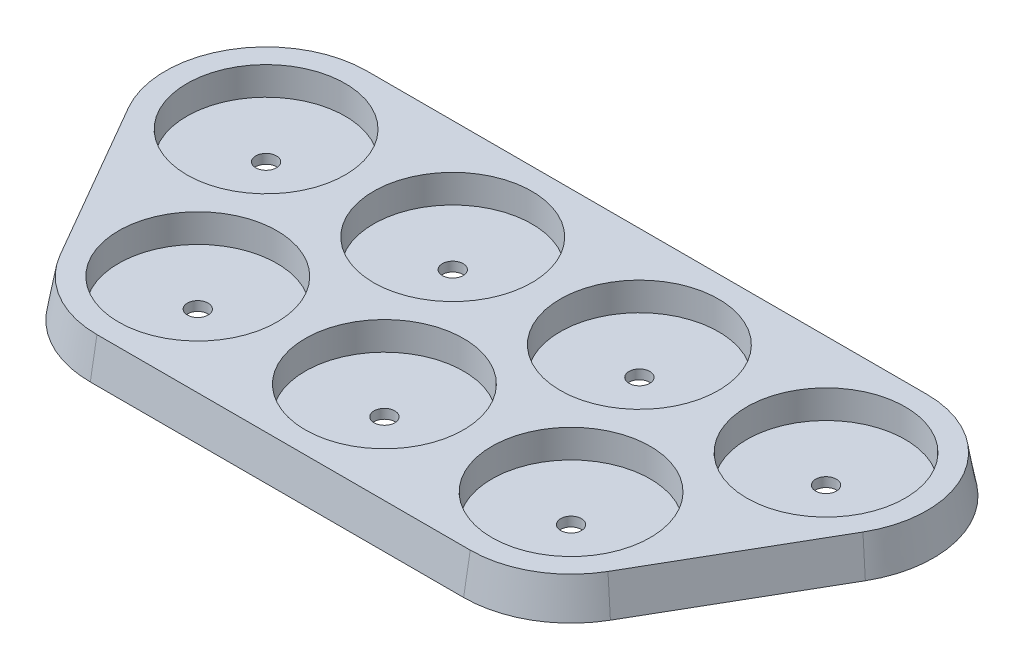
ISO-10303-21;
HEADER;
FILE_DESCRIPTION(('STEP AP214'),'2;1');
FILE_NAME('part.step','',(''),(''),'','','');
FILE_SCHEMA(('AUTOMOTIVE_DESIGN { 1 0 10303 214 1 1 1 1 }'));
ENDSEC;
DATA;
#1=APPLICATION_CONTEXT('core data for automotive mechanical design processes');
#2=APPLICATION_PROTOCOL_DEFINITION('international standard','automotive_design',2000,#1);
#3=PRODUCT_CONTEXT('',#1,'mechanical');
#4=PRODUCT('Part','Part','',(#3));
#5=PRODUCT_RELATED_PRODUCT_CATEGORY('part','',(#4));
#6=PRODUCT_DEFINITION_FORMATION('','',#4);
#7=PRODUCT_DEFINITION_CONTEXT('part definition',#1,'design');
#8=PRODUCT_DEFINITION('design','',#6,#7);
#9=PRODUCT_DEFINITION_SHAPE('','',#8);
#10=(LENGTH_UNIT() NAMED_UNIT(*) SI_UNIT(.MILLI.,.METRE.));
#11=(NAMED_UNIT(*) PLANE_ANGLE_UNIT() SI_UNIT($,.RADIAN.));
#12=(NAMED_UNIT(*) SI_UNIT($,.STERADIAN.) SOLID_ANGLE_UNIT());
#13=UNCERTAINTY_MEASURE_WITH_UNIT(LENGTH_MEASURE(1.E-05),#10,'distance_accuracy_value','');
#14=(GEOMETRIC_REPRESENTATION_CONTEXT(3) GLOBAL_UNCERTAINTY_ASSIGNED_CONTEXT((#13)) GLOBAL_UNIT_ASSIGNED_CONTEXT((#10,
#11,#12)) REPRESENTATION_CONTEXT('',''));
#15=CARTESIAN_POINT('',(0.,0.,0.));
#16=DIRECTION('',(0.,0.,1.));
#17=DIRECTION('',(1.,0.,0.));
#18=AXIS2_PLACEMENT_3D('',#15,#16,#17);
#19=CARTESIAN_POINT('',(-9.90000000000008,0.,17.1473029949318));
#20=DIRECTION('',(0.,1.,0.));
#21=DIRECTION('',(0.,0.,1.));
#22=AXIS2_PLACEMENT_3D('',#19,#20,#21);
#23=CYLINDRICAL_SURFACE('',#22,1.1);
#24=CARTESIAN_POINT('',(-9.90000000000008,0.,17.1473029949318));
#25=DIRECTION('',(0.,1.,0.));
#26=DIRECTION('',(0.,0.,1.));
#27=AXIS2_PLACEMENT_3D('',#24,#25,#26);
#28=CIRCLE('',#27,1.1);
#29=CARTESIAN_POINT('',(-9.90000000000008,0.,18.2473029949318));
#30=VERTEX_POINT('',#29);
#31=EDGE_CURVE('E188',#30,#30,#28,.T.);
#32=ORIENTED_EDGE('',*,*,#31,.F.);
#33=EDGE_LOOP('',(#32));
#34=FACE_BOUND('',#33,.T.);
#35=CARTESIAN_POINT('',(-9.90000000000008,1.,17.1473029949318));
#36=DIRECTION('',(0.,1.,0.));
#37=DIRECTION('',(0.,0.,1.));
#38=AXIS2_PLACEMENT_3D('',#35,#36,#37);
#39=CIRCLE('',#38,1.1);
#40=CARTESIAN_POINT('',(-9.90000000000008,1.,18.2473029949318));
#41=VERTEX_POINT('',#40);
#42=EDGE_CURVE('E669',#41,#41,#39,.T.);
#43=ORIENTED_EDGE('',*,*,#42,.T.);
#44=EDGE_LOOP('',(#43));
#45=FACE_BOUND('',#44,.T.);
#46=ADVANCED_FACE('F110',(#34,#45),#23,.F.);
#47=CARTESIAN_POINT('',(-19.7999999999998,0.,0.));
#48=DIRECTION('',(0.,1.,0.));
#49=DIRECTION('',(0.,0.,1.));
#50=AXIS2_PLACEMENT_3D('',#47,#48,#49);
#51=CYLINDRICAL_SURFACE('',#50,1.10000000000001);
#52=CARTESIAN_POINT('',(-19.7999999999998,0.,0.));
#53=DIRECTION('',(0.,1.,0.));
#54=DIRECTION('',(0.,0.,1.));
#55=AXIS2_PLACEMENT_3D('',#52,#53,#54);
#56=CIRCLE('',#55,1.10000000000001);
#57=CARTESIAN_POINT('',(-19.7999999999998,0.,1.10000000000001));
#58=VERTEX_POINT('',#57);
#59=EDGE_CURVE('E701',#58,#58,#56,.T.);
#60=ORIENTED_EDGE('',*,*,#59,.F.);
#61=EDGE_LOOP('',(#60));
#62=FACE_BOUND('',#61,.T.);
#63=CARTESIAN_POINT('',(-19.7999999999998,1.,0.));
#64=DIRECTION('',(0.,1.,0.));
#65=DIRECTION('',(0.,0.,1.));
#66=AXIS2_PLACEMENT_3D('',#63,#64,#65);
#67=CIRCLE('',#66,1.10000000000001);
#68=CARTESIAN_POINT('',(-19.7999999999998,1.,1.10000000000001));
#69=VERTEX_POINT('',#68);
#70=EDGE_CURVE('E691',#69,#69,#67,.T.);
#71=ORIENTED_EDGE('',*,*,#70,.T.);
#72=EDGE_LOOP('',(#71));
#73=FACE_BOUND('',#72,.T.);
#74=ADVANCED_FACE('F291',(#62,#73),#51,.F.);
#75=CARTESIAN_POINT('',(-59.4,0.,-3.91836563196081E-13));
#76=DIRECTION('',(0.,1.,0.));
#77=DIRECTION('',(0.,0.,1.));
#78=AXIS2_PLACEMENT_3D('',#75,#76,#77);
#79=CYLINDRICAL_SURFACE('',#78,1.1);
#80=CARTESIAN_POINT('',(-59.4,0.,-3.91836563196081E-13));
#81=DIRECTION('',(0.,1.,0.));
#82=DIRECTION('',(0.,0.,1.));
#83=AXIS2_PLACEMENT_3D('',#80,#81,#82);
#84=CIRCLE('',#83,1.1);
#85=CARTESIAN_POINT('',(-59.4,0.,1.09999999999961));
#86=VERTEX_POINT('',#85);
#87=EDGE_CURVE('E705',#86,#86,#84,.T.);
#88=ORIENTED_EDGE('',*,*,#87,.F.);
#89=EDGE_LOOP('',(#88));
#90=FACE_BOUND('',#89,.T.);
#91=CARTESIAN_POINT('',(-59.4,1.,-3.91836563196081E-13));
#92=DIRECTION('',(0.,1.,0.));
#93=DIRECTION('',(0.,0.,1.));
#94=AXIS2_PLACEMENT_3D('',#91,#92,#93);
#95=CIRCLE('',#94,1.1);
#96=CARTESIAN_POINT('',(-59.4,1.,1.09999999999961));
#97=VERTEX_POINT('',#96);
#98=EDGE_CURVE('E742',#97,#97,#95,.T.);
#99=ORIENTED_EDGE('',*,*,#98,.T.);
#100=EDGE_LOOP('',(#99));
#101=FACE_BOUND('',#100,.T.);
#102=ADVANCED_FACE('F297',(#90,#101),#79,.F.);
#103=CARTESIAN_POINT('',(-49.4999999999999,0.,17.1473029949316));
#104=DIRECTION('',(0.,1.,0.));
#105=DIRECTION('',(0.,0.,1.));
#106=AXIS2_PLACEMENT_3D('',#103,#104,#105);
#107=CYLINDRICAL_SURFACE('',#106,1.1);
#108=CARTESIAN_POINT('',(-49.4999999999999,0.,17.1473029949316));
#109=DIRECTION('',(0.,1.,0.));
#110=DIRECTION('',(0.,0.,1.));
#111=AXIS2_PLACEMENT_3D('',#108,#109,#110);
#112=CIRCLE('',#111,1.1);
#113=CARTESIAN_POINT('',(-49.4999999999999,0.,18.2473029949316));
#114=VERTEX_POINT('',#113);
#115=EDGE_CURVE('E709',#114,#114,#112,.T.);
#116=ORIENTED_EDGE('',*,*,#115,.F.);
#117=EDGE_LOOP('',(#116));
#118=FACE_BOUND('',#117,.T.);
#119=CARTESIAN_POINT('',(-49.4999999999999,1.,17.1473029949316));
#120=DIRECTION('',(0.,1.,0.));
#121=DIRECTION('',(0.,0.,1.));
#122=AXIS2_PLACEMENT_3D('',#119,#120,#121);
#123=CIRCLE('',#122,1.1);
#124=CARTESIAN_POINT('',(-49.4999999999999,1.,18.2473029949316));
#125=VERTEX_POINT('',#124);
#126=EDGE_CURVE('E746',#125,#125,#123,.T.);
#127=ORIENTED_EDGE('',*,*,#126,.T.);
#128=EDGE_LOOP('',(#127));
#129=FACE_BOUND('',#128,.T.);
#130=ADVANCED_FACE('F304',(#118,#129),#107,.F.);
#131=CARTESIAN_POINT('',(-39.5999999999999,0.,-2.72581957005969E-13));
#132=DIRECTION('',(0.,1.,0.));
#133=DIRECTION('',(0.,0.,1.));
#134=AXIS2_PLACEMENT_3D('',#131,#132,#133);
#135=CYLINDRICAL_SURFACE('',#134,1.10000000000001);
#136=CARTESIAN_POINT('',(-39.5999999999999,0.,-2.72581957005969E-13));
#137=DIRECTION('',(0.,1.,0.));
#138=DIRECTION('',(0.,0.,1.));
#139=AXIS2_PLACEMENT_3D('',#136,#137,#138);
#140=CIRCLE('',#139,1.10000000000001);
#141=CARTESIAN_POINT('',(-39.5999999999999,0.,1.09999999999974));
#142=VERTEX_POINT('',#141);
#143=EDGE_CURVE('E719',#142,#142,#140,.T.);
#144=ORIENTED_EDGE('',*,*,#143,.F.);
#145=EDGE_LOOP('',(#144));
#146=FACE_BOUND('',#145,.T.);
#147=CARTESIAN_POINT('',(-39.5999999999999,1.,-2.72581957005969E-13));
#148=DIRECTION('',(0.,1.,0.));
#149=DIRECTION('',(0.,0.,1.));
#150=AXIS2_PLACEMENT_3D('',#147,#148,#149);
#151=CIRCLE('',#150,1.10000000000001);
#152=CARTESIAN_POINT('',(-39.5999999999999,1.,1.09999999999974));
#153=VERTEX_POINT('',#152);
#154=EDGE_CURVE('E679',#153,#153,#151,.T.);
#155=ORIENTED_EDGE('',*,*,#154,.T.);
#156=EDGE_LOOP('',(#155));
#157=FACE_BOUND('',#156,.T.);
#158=ADVANCED_FACE('F512',(#146,#157),#135,.F.);
#159=CARTESIAN_POINT('',(-29.6999999999999,0.,17.1473029949318));
#160=DIRECTION('',(0.,1.,0.));
#161=DIRECTION('',(0.,0.,1.));
#162=AXIS2_PLACEMENT_3D('',#159,#160,#161);
#163=CYLINDRICAL_SURFACE('',#162,1.1);
#164=CARTESIAN_POINT('',(-29.6999999999999,0.,17.1473029949318));
#165=DIRECTION('',(0.,1.,0.));
#166=DIRECTION('',(0.,0.,1.));
#167=AXIS2_PLACEMENT_3D('',#164,#165,#166);
#168=CIRCLE('',#167,1.1);
#169=CARTESIAN_POINT('',(-29.6999999999999,0.,18.2473029949318));
#170=VERTEX_POINT('',#169);
#171=EDGE_CURVE('E715',#170,#170,#168,.T.);
#172=ORIENTED_EDGE('',*,*,#171,.F.);
#173=EDGE_LOOP('',(#172));
#174=FACE_BOUND('',#173,.T.);
#175=CARTESIAN_POINT('',(-29.6999999999999,1.,17.1473029949318));
#176=DIRECTION('',(0.,1.,0.));
#177=DIRECTION('',(0.,0.,1.));
#178=AXIS2_PLACEMENT_3D('',#175,#176,#177);
#179=CIRCLE('',#178,1.1);
#180=CARTESIAN_POINT('',(-29.6999999999999,1.,18.2473029949318));
#181=VERTEX_POINT('',#180);
#182=EDGE_CURVE('E671',#181,#181,#179,.T.);
#183=ORIENTED_EDGE('',*,*,#182,.T.);
#184=EDGE_LOOP('',(#183));
#185=FACE_BOUND('',#184,.T.);
#186=ADVANCED_FACE('F520',(#174,#185),#163,.F.);
#187=CARTESIAN_POINT('',(0.,0.,0.));
#188=DIRECTION('',(0.,1.,0.));
#189=DIRECTION('',(0.,0.,1.));
#190=AXIS2_PLACEMENT_3D('',#187,#188,#189);
#191=CYLINDRICAL_SURFACE('',#190,1.1);
#192=CARTESIAN_POINT('',(0.,0.,0.));
#193=DIRECTION('',(0.,1.,0.));
#194=DIRECTION('',(0.,0.,1.));
#195=AXIS2_PLACEMENT_3D('',#192,#193,#194);
#196=CIRCLE('',#195,1.1);
#197=CARTESIAN_POINT('',(0.,0.,1.1));
#198=VERTEX_POINT('',#197);
#199=EDGE_CURVE('E647',#198,#198,#196,.T.);
#200=ORIENTED_EDGE('',*,*,#199,.F.);
#201=EDGE_LOOP('',(#200));
#202=FACE_BOUND('',#201,.T.);
#203=CARTESIAN_POINT('',(0.,1.,0.));
#204=DIRECTION('',(0.,1.,0.));
#205=DIRECTION('',(0.,0.,1.));
#206=AXIS2_PLACEMENT_3D('',#203,#204,#205);
#207=CIRCLE('',#206,1.1);
#208=CARTESIAN_POINT('',(0.,1.,1.1));
#209=VERTEX_POINT('',#208);
#210=EDGE_CURVE('E650',#209,#209,#207,.T.);
#211=ORIENTED_EDGE('',*,*,#210,.T.);
#212=EDGE_LOOP('',(#211));
#213=FACE_BOUND('',#212,.T.);
#214=ADVANCED_FACE('F315',(#202,#213),#191,.F.);
#215=CARTESIAN_POINT('',(-9.90000000000008,0.,17.1473029949318));
#216=DIRECTION('',(0.,-1.,0.));
#217=DIRECTION('',(0.,0.,1.));
#218=AXIS2_PLACEMENT_3D('',#215,#216,#217);
#219=CONICAL_SURFACE('',#218,11.4,0.174532925199433);
#220=CARTESIAN_POINT('',(-9.90000000000008,0.,17.1473029949318));
#221=DIRECTION('',(0.,1.,0.));
#222=DIRECTION('',(0.,0.,1.));
#223=AXIS2_PLACEMENT_3D('',#220,#221,#222);
#224=CIRCLE('',#223,11.4);
#225=CARTESIAN_POINT('',(-9.90000000000008,0.,28.5473029949318));
#226=VERTEX_POINT('',#225);
#227=CARTESIAN_POINT('',(-0.0273103968575087,0.,22.8473029949319));
#228=VERTEX_POINT('',#227);
#229=EDGE_CURVE('E184',#226,#228,#224,.T.);
#230=ORIENTED_EDGE('',*,*,#229,.T.);
#231=DIRECTION('',(0.150383733180435,-0.984807753012208,0.0868240888334661));
#232=VECTOR('',#231,1.);
#233=CARTESIAN_POINT('',(-0.0273103968575079,0.,22.8473029949319));
#234=LINE('',#233,#232);
#235=CARTESIAN_POINT('',(-0.638124975522065,4.,22.494649033515));
#236=VERTEX_POINT('',#235);
#237=EDGE_CURVE('E12',#236,#228,#234,.T.);
#238=ORIENTED_EDGE('',*,*,#237,.F.);
#239=CARTESIAN_POINT('',(-9.90000000000008,4.,17.1473029949318));
#240=DIRECTION('',(0.,1.,0.));
#241=DIRECTION('',(0.,0.,1.));
#242=AXIS2_PLACEMENT_3D('',#239,#240,#241);
#243=CIRCLE('',#242,10.6946920771661);
#244=CARTESIAN_POINT('',(-9.90000000000008,4.,27.841995072098));
#245=VERTEX_POINT('',#244);
#246=EDGE_CURVE('E217',#245,#236,#243,.T.);
#247=ORIENTED_EDGE('',*,*,#246,.F.);
#248=DIRECTION('',(0.,-0.984807753012208,0.173648177666931));
#249=VECTOR('',#248,1.);
#250=CARTESIAN_POINT('',(-9.90000000000008,0.,28.5473029949318));
#251=LINE('',#250,#249);
#252=EDGE_CURVE('E128',#245,#226,#251,.T.);
#253=ORIENTED_EDGE('',*,*,#252,.T.);
#254=EDGE_LOOP('',(#230,#238,#247,#253));
#255=FACE_BOUND('',#254,.T.);
#256=ADVANCED_FACE('F185',(#255),#219,.T.);
#257=CARTESIAN_POINT('',(9.87268960314258,0.,5.70000000000005));
#258=DIRECTION('',(0.852868531952441,0.173648177666931,0.492403876506108));
#259=DIRECTION('',(0.500000000000004,0.,-0.866025403784436));
#260=AXIS2_PLACEMENT_3D('',#257,#258,#259);
#261=PLANE('',#260);
#262=DIRECTION('',(-0.500000000000004,0.,0.866025403784436));
#263=VECTOR('',#262,1.);
#264=CARTESIAN_POINT('',(9.87268960314258,0.,5.70000000000005));
#265=LINE('',#264,#263);
#266=CARTESIAN_POINT('',(9.87268960314258,0.,5.70000000000005));
#267=VERTEX_POINT('',#266);
#268=EDGE_CURVE('E179',#267,#228,#265,.T.);
#269=ORIENTED_EDGE('',*,*,#268,.F.);
#270=DIRECTION('',(0.150383733180435,-0.984807753012208,0.0868240888334661));
#271=VECTOR('',#270,1.);
#272=CARTESIAN_POINT('',(9.87268960314258,0.,5.70000000000004));
#273=LINE('',#272,#271);
#274=CARTESIAN_POINT('',(9.26187502447802,4.,5.34734603858311));
#275=VERTEX_POINT('',#274);
#276=EDGE_CURVE('E120',#275,#267,#273,.T.);
#277=ORIENTED_EDGE('',*,*,#276,.F.);
#278=DIRECTION('',(-0.500000000000004,0.,0.866025403784436));
#279=VECTOR('',#278,1.);
#280=CARTESIAN_POINT('',(9.26187502447802,4.,5.34734603858312));
#281=LINE('',#280,#279);
#282=EDGE_CURVE('E181',#275,#236,#281,.T.);
#283=ORIENTED_EDGE('',*,*,#282,.T.);
#284=ORIENTED_EDGE('',*,*,#237,.T.);
#285=EDGE_LOOP('',(#269,#277,#283,#284));
#286=FACE_BOUND('',#285,.T.);
#287=ADVANCED_FACE('F112',(#286),#261,.T.);
#288=CARTESIAN_POINT('',(0.,0.,0.));
#289=DIRECTION('',(0.,-1.,0.));
#290=DIRECTION('',(0.,0.,1.));
#291=AXIS2_PLACEMENT_3D('',#288,#289,#290);
#292=CONICAL_SURFACE('',#291,11.4,0.174532925199433);
#293=CARTESIAN_POINT('',(0.,0.,0.));
#294=DIRECTION('',(0.,1.,0.));
#295=DIRECTION('',(0.,0.,1.));
#296=AXIS2_PLACEMENT_3D('',#293,#294,#295);
#297=CIRCLE('',#296,11.4);
#298=CARTESIAN_POINT('',(0.,0.,-11.4));
#299=VERTEX_POINT('',#298);
#300=EDGE_CURVE('E193',#267,#299,#297,.T.);
#301=ORIENTED_EDGE('',*,*,#300,.T.);
#302=DIRECTION('',(0.,-0.984807753012208,-0.173648177666931));
#303=VECTOR('',#302,1.);
#304=CARTESIAN_POINT('',(0.,0.,-11.4));
#305=LINE('',#304,#303);
#306=CARTESIAN_POINT('',(0.,4.,-10.6946920771662));
#307=VERTEX_POINT('',#306);
#308=EDGE_CURVE('E234',#307,#299,#305,.T.);
#309=ORIENTED_EDGE('',*,*,#308,.F.);
#310=CARTESIAN_POINT('',(0.,4.,0.));
#311=DIRECTION('',(0.,1.,0.));
#312=DIRECTION('',(0.,0.,1.));
#313=AXIS2_PLACEMENT_3D('',#310,#311,#312);
#314=CIRCLE('',#313,10.6946920771661);
#315=EDGE_CURVE('E244',#275,#307,#314,.T.);
#316=ORIENTED_EDGE('',*,*,#315,.F.);
#317=ORIENTED_EDGE('',*,*,#276,.T.);
#318=EDGE_LOOP('',(#301,#309,#316,#317));
#319=FACE_BOUND('',#318,.T.);
#320=ADVANCED_FACE('F283',(#319),#292,.T.);
#321=CARTESIAN_POINT('',(0.,0.,-11.4));
#322=DIRECTION('',(0.,0.173648177666931,-0.984807753012208));
#323=DIRECTION('',(0.,0.984807753012208,0.173648177666931));
#324=AXIS2_PLACEMENT_3D('',#321,#322,#323);
#325=PLANE('',#324);
#326=DIRECTION('',(-1.,0.,0.));
#327=VECTOR('',#326,1.);
#328=CARTESIAN_POINT('',(0.,0.,-11.4));
#329=LINE('',#328,#327);
#330=CARTESIAN_POINT('',(-59.3999999999999,0.,-11.4000000000004));
#331=VERTEX_POINT('',#330);
#332=EDGE_CURVE('E197',#299,#331,#329,.T.);
#333=ORIENTED_EDGE('',*,*,#332,.T.);
#334=DIRECTION('',(0.,-0.984807753012208,-0.173648177666931));
#335=VECTOR('',#334,1.);
#336=CARTESIAN_POINT('',(-59.3999999999999,0.,-11.4000000000004));
#337=LINE('',#336,#335);
#338=CARTESIAN_POINT('',(-59.3999999999999,4.,-10.6946920771665));
#339=VERTEX_POINT('',#338);
#340=EDGE_CURVE('E230',#339,#331,#337,.T.);
#341=ORIENTED_EDGE('',*,*,#340,.F.);
#342=DIRECTION('',(1.,0.,0.));
#343=VECTOR('',#342,1.);
#344=CARTESIAN_POINT('',(0.,4.,-10.6946920771662));
#345=LINE('',#344,#343);
#346=EDGE_CURVE('E247',#307,#339,#345,.F.);
#347=ORIENTED_EDGE('',*,*,#346,.F.);
#348=ORIENTED_EDGE('',*,*,#308,.T.);
#349=EDGE_LOOP('',(#333,#341,#347,#348));
#350=FACE_BOUND('',#349,.T.);
#351=ADVANCED_FACE('F278',(#350),#325,.T.);
#352=CARTESIAN_POINT('',(-59.4,0.,-3.91836563196081E-13));
#353=DIRECTION('',(0.,-1.,0.));
#354=DIRECTION('',(0.,0.,1.));
#355=AXIS2_PLACEMENT_3D('',#352,#353,#354);
#356=CONICAL_SURFACE('',#355,11.4,0.174532925199433);
#357=CARTESIAN_POINT('',(-59.4,0.,-3.91836563196081E-13));
#358=DIRECTION('',(0.,1.,0.));
#359=DIRECTION('',(0.,0.,1.));
#360=AXIS2_PLACEMENT_3D('',#357,#358,#359);
#361=CIRCLE('',#360,11.4);
#362=CARTESIAN_POINT('',(-69.2726896031426,0.,5.69999999999959));
#363=VERTEX_POINT('',#362);
#364=EDGE_CURVE('E203',#331,#363,#361,.T.);
#365=ORIENTED_EDGE('',*,*,#364,.T.);
#366=DIRECTION('',(-0.150383733180436,-0.984807753012208,0.0868240888334652));
#367=VECTOR('',#366,1.);
#368=CARTESIAN_POINT('',(-69.2726896031425,0.,5.69999999999958));
#369=LINE('',#368,#367);
#370=CARTESIAN_POINT('',(-68.661875024478,4.,5.34734603858265));
#371=VERTEX_POINT('',#370);
#372=EDGE_CURVE('E227',#371,#363,#369,.T.);
#373=ORIENTED_EDGE('',*,*,#372,.F.);
#374=CARTESIAN_POINT('',(-59.4,4.,-3.91836563196081E-13));
#375=DIRECTION('',(0.,1.,0.));
#376=DIRECTION('',(0.,0.,1.));
#377=AXIS2_PLACEMENT_3D('',#374,#375,#376);
#378=CIRCLE('',#377,10.6946920771661);
#379=EDGE_CURVE('E250',#339,#371,#378,.T.);
#380=ORIENTED_EDGE('',*,*,#379,.F.);
#381=ORIENTED_EDGE('',*,*,#340,.T.);
#382=EDGE_LOOP('',(#365,#373,#380,#381));
#383=FACE_BOUND('',#382,.T.);
#384=ADVANCED_FACE('F275',(#383),#356,.T.);
#385=CARTESIAN_POINT('',(-54.4226896031425,0.,31.4209544923976));
#386=DIRECTION('',(-0.852868531952444,0.173648177666931,0.492403876506103));
#387=DIRECTION('',(0.499999999999999,0.,0.86602540378444));
#388=AXIS2_PLACEMENT_3D('',#385,#386,#387);
#389=PLANE('',#388);
#390=DIRECTION('',(-0.499999999999999,0.,-0.86602540378444));
#391=VECTOR('',#390,1.);
#392=CARTESIAN_POINT('',(-54.4226896031425,0.,31.4209544923976));
#393=LINE('',#392,#391);
#394=CARTESIAN_POINT('',(-59.3726896031425,0.,22.8473029949316));
#395=VERTEX_POINT('',#394);
#396=EDGE_CURVE('E207',#395,#363,#393,.T.);
#397=ORIENTED_EDGE('',*,*,#396,.F.);
#398=DIRECTION('',(-0.150383733180436,-0.984807753012208,0.0868240888334654));
#399=VECTOR('',#398,1.);
#400=CARTESIAN_POINT('',(-59.3726896031425,0.,22.8473029949316));
#401=LINE('',#400,#399);
#402=CARTESIAN_POINT('',(-58.761875024478,4.,22.4946490335146));
#403=VERTEX_POINT('',#402);
#404=EDGE_CURVE('E224',#403,#395,#401,.T.);
#405=ORIENTED_EDGE('',*,*,#404,.F.);
#406=DIRECTION('',(-0.499999999999999,0.,-0.86602540378444));
#407=VECTOR('',#406,1.);
#408=CARTESIAN_POINT('',(-53.8118750244779,4.,31.0683005309807));
#409=LINE('',#408,#407);
#410=EDGE_CURVE('E253',#403,#371,#409,.T.);
#411=ORIENTED_EDGE('',*,*,#410,.T.);
#412=ORIENTED_EDGE('',*,*,#372,.T.);
#413=EDGE_LOOP('',(#397,#405,#411,#412));
#414=FACE_BOUND('',#413,.T.);
#415=ADVANCED_FACE('F271',(#414),#389,.T.);
#416=CARTESIAN_POINT('',(-49.4999999999999,0.,17.1473029949316));
#417=DIRECTION('',(0.,-1.,0.));
#418=DIRECTION('',(0.,0.,1.));
#419=AXIS2_PLACEMENT_3D('',#416,#417,#418);
#420=CONICAL_SURFACE('',#419,11.4,0.174532925199433);
#421=CARTESIAN_POINT('',(-49.4999999999999,0.,17.1473029949316));
#422=DIRECTION('',(0.,1.,0.));
#423=DIRECTION('',(0.,0.,1.));
#424=AXIS2_PLACEMENT_3D('',#421,#422,#423);
#425=CIRCLE('',#424,11.4);
#426=CARTESIAN_POINT('',(-49.5000000000001,0.,28.5473029949316));
#427=VERTEX_POINT('',#426);
#428=EDGE_CURVE('E211',#395,#427,#425,.T.);
#429=ORIENTED_EDGE('',*,*,#428,.T.);
#430=DIRECTION('',(0.,-0.984807753012208,0.173648177666931));
#431=VECTOR('',#430,1.);
#432=CARTESIAN_POINT('',(-49.5000000000001,0.,28.5473029949316));
#433=LINE('',#432,#431);
#434=CARTESIAN_POINT('',(-49.5000000000001,4.,27.8419950720977));
#435=VERTEX_POINT('',#434);
#436=EDGE_CURVE('E221',#435,#427,#433,.T.);
#437=ORIENTED_EDGE('',*,*,#436,.F.);
#438=CARTESIAN_POINT('',(-49.4999999999999,4.,17.1473029949316));
#439=DIRECTION('',(0.,1.,0.));
#440=DIRECTION('',(0.,0.,1.));
#441=AXIS2_PLACEMENT_3D('',#438,#439,#440);
#442=CIRCLE('',#441,10.6946920771661);
#443=EDGE_CURVE('E256',#403,#435,#442,.T.);
#444=ORIENTED_EDGE('',*,*,#443,.F.);
#445=ORIENTED_EDGE('',*,*,#404,.T.);
#446=EDGE_LOOP('',(#429,#437,#444,#445));
#447=FACE_BOUND('',#446,.T.);
#448=ADVANCED_FACE('F265',(#447),#420,.T.);
#449=CARTESIAN_POINT('',(-3.80166406845053E-13,0.,28.5473029949322));
#450=DIRECTION('',(0.,0.173648177666931,0.984807753012208));
#451=DIRECTION('',(0.,-0.984807753012208,0.173648177666931));
#452=AXIS2_PLACEMENT_3D('',#449,#450,#451);
#453=PLANE('',#452);
#454=DIRECTION('',(-1.,0.,0.));
#455=VECTOR('',#454,1.);
#456=CARTESIAN_POINT('',(-3.70773772493896E-13,4.,27.8419950720984));
#457=LINE('',#456,#455);
#458=EDGE_CURVE('E114',#245,#435,#457,.T.);
#459=ORIENTED_EDGE('',*,*,#458,.T.);
#460=ORIENTED_EDGE('',*,*,#436,.T.);
#461=DIRECTION('',(-1.,0.,0.));
#462=VECTOR('',#461,1.);
#463=CARTESIAN_POINT('',(-3.80166406845053E-13,0.,28.5473029949322));
#464=LINE('',#463,#462);
#465=EDGE_CURVE('E215',#226,#427,#464,.T.);
#466=ORIENTED_EDGE('',*,*,#465,.F.);
#467=ORIENTED_EDGE('',*,*,#252,.F.);
#468=EDGE_LOOP('',(#459,#460,#466,#467));
#469=FACE_BOUND('',#468,.T.);
#470=ADVANCED_FACE('F267',(#469),#453,.T.);
#471=CARTESIAN_POINT('',(0.,0.,0.));
#472=DIRECTION('',(0.,1.,0.));
#473=DIRECTION('',(0.,0.,1.));
#474=AXIS2_PLACEMENT_3D('',#471,#472,#473);
#475=PLANE('',#474);
#476=ORIENTED_EDGE('',*,*,#199,.T.);
#477=EDGE_LOOP('',(#476));
#478=FACE_BOUND('',#477,.T.);
#479=ORIENTED_EDGE('',*,*,#171,.T.);
#480=EDGE_LOOP('',(#479));
#481=FACE_BOUND('',#480,.T.);
#482=ORIENTED_EDGE('',*,*,#143,.T.);
#483=EDGE_LOOP('',(#482));
#484=FACE_BOUND('',#483,.T.);
#485=ORIENTED_EDGE('',*,*,#115,.T.);
#486=EDGE_LOOP('',(#485));
#487=FACE_BOUND('',#486,.T.);
#488=ORIENTED_EDGE('',*,*,#87,.T.);
#489=EDGE_LOOP('',(#488));
#490=FACE_BOUND('',#489,.T.);
#491=ORIENTED_EDGE('',*,*,#59,.T.);
#492=EDGE_LOOP('',(#491));
#493=FACE_BOUND('',#492,.T.);
#494=ORIENTED_EDGE('',*,*,#31,.T.);
#495=EDGE_LOOP('',(#494));
#496=FACE_BOUND('',#495,.T.);
#497=ORIENTED_EDGE('',*,*,#465,.T.);
#498=ORIENTED_EDGE('',*,*,#428,.F.);
#499=ORIENTED_EDGE('',*,*,#396,.T.);
#500=ORIENTED_EDGE('',*,*,#364,.F.);
#501=ORIENTED_EDGE('',*,*,#332,.F.);
#502=ORIENTED_EDGE('',*,*,#300,.F.);
#503=ORIENTED_EDGE('',*,*,#268,.T.);
#504=ORIENTED_EDGE('',*,*,#229,.F.);
#505=EDGE_LOOP('',(#497,#498,#499,#500,#501,#502,#503,#504));
#506=FACE_BOUND('',#505,.T.);
#507=ADVANCED_FACE('F191',(#478,#481,#484,#487,#490,#493,#496,#506),#475,.F.);
#508=CARTESIAN_POINT('',(0.,4.,0.));
#509=DIRECTION('',(0.,1.,0.));
#510=DIRECTION('',(0.,0.,1.));
#511=AXIS2_PLACEMENT_3D('',#508,#509,#510);
#512=PLANE('',#511);
#513=CARTESIAN_POINT('',(-9.90000000000008,4.,17.1473029949318));
#514=DIRECTION('',(0.,1.,0.));
#515=DIRECTION('',(0.,0.,1.));
#516=AXIS2_PLACEMENT_3D('',#513,#514,#515);
#517=CIRCLE('',#516,8.4);
#518=CARTESIAN_POINT('',(-9.90000000000008,4.,25.5473029949318));
#519=VERTEX_POINT('',#518);
#520=EDGE_CURVE('E665',#519,#519,#517,.T.);
#521=ORIENTED_EDGE('',*,*,#520,.F.);
#522=EDGE_LOOP('',(#521));
#523=FACE_BOUND('',#522,.T.);
#524=CARTESIAN_POINT('',(0.,4.,0.));
#525=DIRECTION('',(0.,1.,0.));
#526=DIRECTION('',(0.,0.,1.));
#527=AXIS2_PLACEMENT_3D('',#524,#525,#526);
#528=CIRCLE('',#527,8.4);
#529=CARTESIAN_POINT('',(0.,4.,8.4));
#530=VERTEX_POINT('',#529);
#531=EDGE_CURVE('E652',#530,#530,#528,.T.);
#532=ORIENTED_EDGE('',*,*,#531,.F.);
#533=EDGE_LOOP('',(#532));
#534=FACE_BOUND('',#533,.T.);
#535=CARTESIAN_POINT('',(-29.6999999999999,4.,17.1473029949318));
#536=DIRECTION('',(0.,1.,0.));
#537=DIRECTION('',(0.,0.,1.));
#538=AXIS2_PLACEMENT_3D('',#535,#536,#537);
#539=CIRCLE('',#538,8.4);
#540=CARTESIAN_POINT('',(-29.6999999999999,4.,25.5473029949318));
#541=VERTEX_POINT('',#540);
#542=EDGE_CURVE('E661',#541,#541,#539,.T.);
#543=ORIENTED_EDGE('',*,*,#542,.F.);
#544=EDGE_LOOP('',(#543));
#545=FACE_BOUND('',#544,.T.);
#546=CARTESIAN_POINT('',(-39.5999999999999,4.,-2.72581957005969E-13));
#547=DIRECTION('',(0.,1.,0.));
#548=DIRECTION('',(0.,0.,1.));
#549=AXIS2_PLACEMENT_3D('',#546,#547,#548);
#550=CIRCLE('',#549,8.40000000000002);
#551=CARTESIAN_POINT('',(-39.5999999999999,4.,8.39999999999974));
#552=VERTEX_POINT('',#551);
#553=EDGE_CURVE('E683',#552,#552,#550,.T.);
#554=ORIENTED_EDGE('',*,*,#553,.F.);
#555=EDGE_LOOP('',(#554));
#556=FACE_BOUND('',#555,.T.);
#557=CARTESIAN_POINT('',(-49.4999999999999,4.,17.1473029949316));
#558=DIRECTION('',(0.,1.,0.));
#559=DIRECTION('',(0.,0.,1.));
#560=AXIS2_PLACEMENT_3D('',#557,#558,#559);
#561=CIRCLE('',#560,8.4);
#562=CARTESIAN_POINT('',(-49.4999999999999,4.,25.5473029949316));
#563=VERTEX_POINT('',#562);
#564=EDGE_CURVE('E750',#563,#563,#561,.T.);
#565=ORIENTED_EDGE('',*,*,#564,.F.);
#566=EDGE_LOOP('',(#565));
#567=FACE_BOUND('',#566,.T.);
#568=CARTESIAN_POINT('',(-59.4,4.,-3.91836563196081E-13));
#569=DIRECTION('',(0.,1.,0.));
#570=DIRECTION('',(0.,0.,1.));
#571=AXIS2_PLACEMENT_3D('',#568,#569,#570);
#572=CIRCLE('',#571,8.4);
#573=CARTESIAN_POINT('',(-59.4,4.,8.39999999999961));
#574=VERTEX_POINT('',#573);
#575=EDGE_CURVE('E737',#574,#574,#572,.T.);
#576=ORIENTED_EDGE('',*,*,#575,.F.);
#577=EDGE_LOOP('',(#576));
#578=FACE_BOUND('',#577,.T.);
#579=CARTESIAN_POINT('',(-19.7999999999998,4.,0.));
#580=DIRECTION('',(0.,1.,0.));
#581=DIRECTION('',(0.,0.,1.));
#582=AXIS2_PLACEMENT_3D('',#579,#580,#581);
#583=CIRCLE('',#582,8.40000000000001);
#584=CARTESIAN_POINT('',(-19.7999999999998,4.,8.40000000000001));
#585=VERTEX_POINT('',#584);
#586=EDGE_CURVE('E695',#585,#585,#583,.T.);
#587=ORIENTED_EDGE('',*,*,#586,.F.);
#588=EDGE_LOOP('',(#587));
#589=FACE_BOUND('',#588,.T.);
#590=ORIENTED_EDGE('',*,*,#443,.T.);
#591=ORIENTED_EDGE('',*,*,#458,.F.);
#592=ORIENTED_EDGE('',*,*,#246,.T.);
#593=ORIENTED_EDGE('',*,*,#282,.F.);
#594=ORIENTED_EDGE('',*,*,#315,.T.);
#595=ORIENTED_EDGE('',*,*,#346,.T.);
#596=ORIENTED_EDGE('',*,*,#379,.T.);
#597=ORIENTED_EDGE('',*,*,#410,.F.);
#598=EDGE_LOOP('',(#590,#591,#592,#593,#594,#595,#596,#597));
#599=FACE_BOUND('',#598,.T.);
#600=ADVANCED_FACE('F263',(#523,#534,#545,#556,#567,#578,#589,#599),#512,.T.);
#601=CARTESIAN_POINT('',(0.,1.,0.));
#602=DIRECTION('',(0.,1.,0.));
#603=DIRECTION('',(0.,0.,1.));
#604=AXIS2_PLACEMENT_3D('',#601,#602,#603);
#605=CYLINDRICAL_SURFACE('',#604,8.4);
#606=CARTESIAN_POINT('',(0.,1.,0.));
#607=DIRECTION('',(0.,1.,0.));
#608=DIRECTION('',(0.,0.,1.));
#609=AXIS2_PLACEMENT_3D('',#606,#607,#608);
#610=CIRCLE('',#609,8.4);
#611=CARTESIAN_POINT('',(0.,1.,8.4));
#612=VERTEX_POINT('',#611);
#613=EDGE_CURVE('E658',#612,#612,#610,.T.);
#614=ORIENTED_EDGE('',*,*,#613,.F.);
#615=EDGE_LOOP('',(#614));
#616=FACE_BOUND('',#615,.T.);
#617=ORIENTED_EDGE('',*,*,#531,.T.);
#618=EDGE_LOOP('',(#617));
#619=FACE_BOUND('',#618,.T.);
#620=ADVANCED_FACE('F308',(#616,#619),#605,.F.);
#621=CARTESIAN_POINT('',(0.,1.,0.));
#622=DIRECTION('',(0.,1.,0.));
#623=DIRECTION('',(0.,0.,1.));
#624=AXIS2_PLACEMENT_3D('',#621,#622,#623);
#625=PLANE('',#624);
#626=ORIENTED_EDGE('',*,*,#210,.F.);
#627=EDGE_LOOP('',(#626));
#628=FACE_BOUND('',#627,.T.);
#629=ORIENTED_EDGE('',*,*,#613,.T.);
#630=EDGE_LOOP('',(#629));
#631=FACE_BOUND('',#630,.T.);
#632=ADVANCED_FACE('F354',(#628,#631),#625,.T.);
#633=CARTESIAN_POINT('',(-29.6999999999999,1.,17.1473029949318));
#634=DIRECTION('',(0.,1.,0.));
#635=DIRECTION('',(0.,0.,1.));
#636=AXIS2_PLACEMENT_3D('',#633,#634,#635);
#637=CYLINDRICAL_SURFACE('',#636,8.4);
#638=CARTESIAN_POINT('',(-29.6999999999999,1.,17.1473029949318));
#639=DIRECTION('',(0.,1.,0.));
#640=DIRECTION('',(0.,0.,1.));
#641=AXIS2_PLACEMENT_3D('',#638,#639,#640);
#642=CIRCLE('',#641,8.4);
#643=CARTESIAN_POINT('',(-29.6999999999999,1.,25.5473029949318));
#644=VERTEX_POINT('',#643);
#645=EDGE_CURVE('E653',#644,#644,#642,.T.);
#646=ORIENTED_EDGE('',*,*,#645,.F.);
#647=EDGE_LOOP('',(#646));
#648=FACE_BOUND('',#647,.T.);
#649=ORIENTED_EDGE('',*,*,#542,.T.);
#650=EDGE_LOOP('',(#649));
#651=FACE_BOUND('',#650,.T.);
#652=ADVANCED_FACE('F362',(#648,#651),#637,.F.);
#653=CARTESIAN_POINT('',(-29.6999999999999,1.,17.1473029949318));
#654=DIRECTION('',(0.,1.,0.));
#655=DIRECTION('',(0.,0.,1.));
#656=AXIS2_PLACEMENT_3D('',#653,#654,#655);
#657=PLANE('',#656);
#658=ORIENTED_EDGE('',*,*,#182,.F.);
#659=EDGE_LOOP('',(#658));
#660=FACE_BOUND('',#659,.T.);
#661=ORIENTED_EDGE('',*,*,#645,.T.);
#662=EDGE_LOOP('',(#661));
#663=FACE_BOUND('',#662,.T.);
#664=ADVANCED_FACE('F370',(#660,#663),#657,.T.);
#665=CARTESIAN_POINT('',(-39.5999999999999,1.,-2.72581957005969E-13));
#666=DIRECTION('',(0.,1.,0.));
#667=DIRECTION('',(0.,0.,1.));
#668=AXIS2_PLACEMENT_3D('',#665,#666,#667);
#669=CYLINDRICAL_SURFACE('',#668,8.40000000000002);
#670=CARTESIAN_POINT('',(-39.5999999999999,1.,-2.72581957005969E-13));
#671=DIRECTION('',(0.,1.,0.));
#672=DIRECTION('',(0.,0.,1.));
#673=AXIS2_PLACEMENT_3D('',#670,#671,#672);
#674=CIRCLE('',#673,8.40000000000002);
#675=CARTESIAN_POINT('',(-39.5999999999999,1.,8.39999999999974));
#676=VERTEX_POINT('',#675);
#677=EDGE_CURVE('E674',#676,#676,#674,.T.);
#678=ORIENTED_EDGE('',*,*,#677,.F.);
#679=EDGE_LOOP('',(#678));
#680=FACE_BOUND('',#679,.T.);
#681=ORIENTED_EDGE('',*,*,#553,.T.);
#682=EDGE_LOOP('',(#681));
#683=FACE_BOUND('',#682,.T.);
#684=ADVANCED_FACE('F378',(#680,#683),#669,.F.);
#685=CARTESIAN_POINT('',(-39.5999999999999,1.,-2.72581957005969E-13));
#686=DIRECTION('',(0.,1.,0.));
#687=DIRECTION('',(0.,0.,1.));
#688=AXIS2_PLACEMENT_3D('',#685,#686,#687);
#689=PLANE('',#688);
#690=ORIENTED_EDGE('',*,*,#154,.F.);
#691=EDGE_LOOP('',(#690));
#692=FACE_BOUND('',#691,.T.);
#693=ORIENTED_EDGE('',*,*,#677,.T.);
#694=EDGE_LOOP('',(#693));
#695=FACE_BOUND('',#694,.T.);
#696=ADVANCED_FACE('F386',(#692,#695),#689,.T.);
#697=CARTESIAN_POINT('',(-49.4999999999999,1.,17.1473029949316));
#698=DIRECTION('',(0.,1.,0.));
#699=DIRECTION('',(0.,0.,1.));
#700=AXIS2_PLACEMENT_3D('',#697,#698,#699);
#701=CYLINDRICAL_SURFACE('',#700,8.4);
#702=CARTESIAN_POINT('',(-49.4999999999999,1.,17.1473029949316));
#703=DIRECTION('',(0.,1.,0.));
#704=DIRECTION('',(0.,0.,1.));
#705=AXIS2_PLACEMENT_3D('',#702,#703,#704);
#706=CIRCLE('',#705,8.4);
#707=CARTESIAN_POINT('',(-49.4999999999999,1.,25.5473029949316));
#708=VERTEX_POINT('',#707);
#709=EDGE_CURVE('E684',#708,#708,#706,.T.);
#710=ORIENTED_EDGE('',*,*,#709,.F.);
#711=EDGE_LOOP('',(#710));
#712=FACE_BOUND('',#711,.T.);
#713=ORIENTED_EDGE('',*,*,#564,.T.);
#714=EDGE_LOOP('',(#713));
#715=FACE_BOUND('',#714,.T.);
#716=ADVANCED_FACE('F394',(#712,#715),#701,.F.);
#717=CARTESIAN_POINT('',(-49.4999999999999,1.,17.1473029949316));
#718=DIRECTION('',(0.,1.,0.));
#719=DIRECTION('',(0.,0.,1.));
#720=AXIS2_PLACEMENT_3D('',#717,#718,#719);
#721=PLANE('',#720);
#722=ORIENTED_EDGE('',*,*,#126,.F.);
#723=EDGE_LOOP('',(#722));
#724=FACE_BOUND('',#723,.T.);
#725=ORIENTED_EDGE('',*,*,#709,.T.);
#726=EDGE_LOOP('',(#725));
#727=FACE_BOUND('',#726,.T.);
#728=ADVANCED_FACE('F402',(#724,#727),#721,.T.);
#729=CARTESIAN_POINT('',(-59.4,1.,-3.91836563196081E-13));
#730=DIRECTION('',(0.,1.,0.));
#731=DIRECTION('',(0.,0.,1.));
#732=AXIS2_PLACEMENT_3D('',#729,#730,#731);
#733=CYLINDRICAL_SURFACE('',#732,8.4);
#734=CARTESIAN_POINT('',(-59.4,1.,-3.91836563196081E-13));
#735=DIRECTION('',(0.,1.,0.));
#736=DIRECTION('',(0.,0.,1.));
#737=AXIS2_PLACEMENT_3D('',#734,#735,#736);
#738=CIRCLE('',#737,8.4);
#739=CARTESIAN_POINT('',(-59.4,1.,8.39999999999961));
#740=VERTEX_POINT('',#739);
#741=EDGE_CURVE('E741',#740,#740,#738,.T.);
#742=ORIENTED_EDGE('',*,*,#741,.F.);
#743=EDGE_LOOP('',(#742));
#744=FACE_BOUND('',#743,.T.);
#745=ORIENTED_EDGE('',*,*,#575,.T.);
#746=EDGE_LOOP('',(#745));
#747=FACE_BOUND('',#746,.T.);
#748=ADVANCED_FACE('F410',(#744,#747),#733,.F.);
#749=CARTESIAN_POINT('',(-59.4,1.,-3.91836563196081E-13));
#750=DIRECTION('',(0.,1.,0.));
#751=DIRECTION('',(0.,0.,1.));
#752=AXIS2_PLACEMENT_3D('',#749,#750,#751);
#753=PLANE('',#752);
#754=ORIENTED_EDGE('',*,*,#98,.F.);
#755=EDGE_LOOP('',(#754));
#756=FACE_BOUND('',#755,.T.);
#757=ORIENTED_EDGE('',*,*,#741,.T.);
#758=EDGE_LOOP('',(#757));
#759=FACE_BOUND('',#758,.T.);
#760=ADVANCED_FACE('F418',(#756,#759),#753,.T.);
#761=CARTESIAN_POINT('',(-19.7999999999998,1.,0.));
#762=DIRECTION('',(0.,1.,0.));
#763=DIRECTION('',(0.,0.,1.));
#764=AXIS2_PLACEMENT_3D('',#761,#762,#763);
#765=CYLINDRICAL_SURFACE('',#764,8.40000000000001);
#766=CARTESIAN_POINT('',(-19.7999999999998,1.,0.));
#767=DIRECTION('',(0.,1.,0.));
#768=DIRECTION('',(0.,0.,1.));
#769=AXIS2_PLACEMENT_3D('',#766,#767,#768);
#770=CIRCLE('',#769,8.40000000000001);
#771=CARTESIAN_POINT('',(-19.7999999999998,1.,8.40000000000001));
#772=VERTEX_POINT('',#771);
#773=EDGE_CURVE('E697',#772,#772,#770,.T.);
#774=ORIENTED_EDGE('',*,*,#773,.F.);
#775=EDGE_LOOP('',(#774));
#776=FACE_BOUND('',#775,.T.);
#777=ORIENTED_EDGE('',*,*,#586,.T.);
#778=EDGE_LOOP('',(#777));
#779=FACE_BOUND('',#778,.T.);
#780=ADVANCED_FACE('F426',(#776,#779),#765,.F.);
#781=CARTESIAN_POINT('',(-19.7999999999998,1.,0.));
#782=DIRECTION('',(0.,1.,0.));
#783=DIRECTION('',(0.,0.,1.));
#784=AXIS2_PLACEMENT_3D('',#781,#782,#783);
#785=PLANE('',#784);
#786=ORIENTED_EDGE('',*,*,#70,.F.);
#787=EDGE_LOOP('',(#786));
#788=FACE_BOUND('',#787,.T.);
#789=ORIENTED_EDGE('',*,*,#773,.T.);
#790=EDGE_LOOP('',(#789));
#791=FACE_BOUND('',#790,.T.);
#792=ADVANCED_FACE('F434',(#788,#791),#785,.T.);
#793=CARTESIAN_POINT('',(-9.90000000000008,1.,17.1473029949318));
#794=DIRECTION('',(0.,1.,0.));
#795=DIRECTION('',(0.,0.,1.));
#796=AXIS2_PLACEMENT_3D('',#793,#794,#795);
#797=CYLINDRICAL_SURFACE('',#796,8.4);
#798=CARTESIAN_POINT('',(-9.90000000000008,1.,17.1473029949318));
#799=DIRECTION('',(0.,1.,0.));
#800=DIRECTION('',(0.,0.,1.));
#801=AXIS2_PLACEMENT_3D('',#798,#799,#800);
#802=CIRCLE('',#801,8.4);
#803=CARTESIAN_POINT('',(-9.90000000000008,1.,25.5473029949318));
#804=VERTEX_POINT('',#803);
#805=EDGE_CURVE('E696',#804,#804,#802,.T.);
#806=ORIENTED_EDGE('',*,*,#805,.F.);
#807=EDGE_LOOP('',(#806));
#808=FACE_BOUND('',#807,.T.);
#809=ORIENTED_EDGE('',*,*,#520,.T.);
#810=EDGE_LOOP('',(#809));
#811=FACE_BOUND('',#810,.T.);
#812=ADVANCED_FACE('F442',(#808,#811),#797,.F.);
#813=CARTESIAN_POINT('',(-9.90000000000008,1.,17.1473029949318));
#814=DIRECTION('',(0.,1.,0.));
#815=DIRECTION('',(0.,0.,1.));
#816=AXIS2_PLACEMENT_3D('',#813,#814,#815);
#817=PLANE('',#816);
#818=ORIENTED_EDGE('',*,*,#42,.F.);
#819=EDGE_LOOP('',(#818));
#820=FACE_BOUND('',#819,.T.);
#821=ORIENTED_EDGE('',*,*,#805,.T.);
#822=EDGE_LOOP('',(#821));
#823=FACE_BOUND('',#822,.T.);
#824=ADVANCED_FACE('F450',(#820,#823),#817,.T.);
#825=CLOSED_SHELL('',(#46,#74,#102,#130,#158,#186,#214,#256,#287,#320,#351,#384,#415,#448,#470,
#507,#600,#620,#632,#652,#664,#684,#696,#716,#728,#748,#760,#780,#792,#812,#824));
#826=MANIFOLD_SOLID_BREP('B2',#825);
#827=ADVANCED_BREP_SHAPE_REPRESENTATION('',(#18,#826),#14);
#828=SHAPE_DEFINITION_REPRESENTATION(#9,#827);
ENDSEC;
END-ISO-10303-21;
